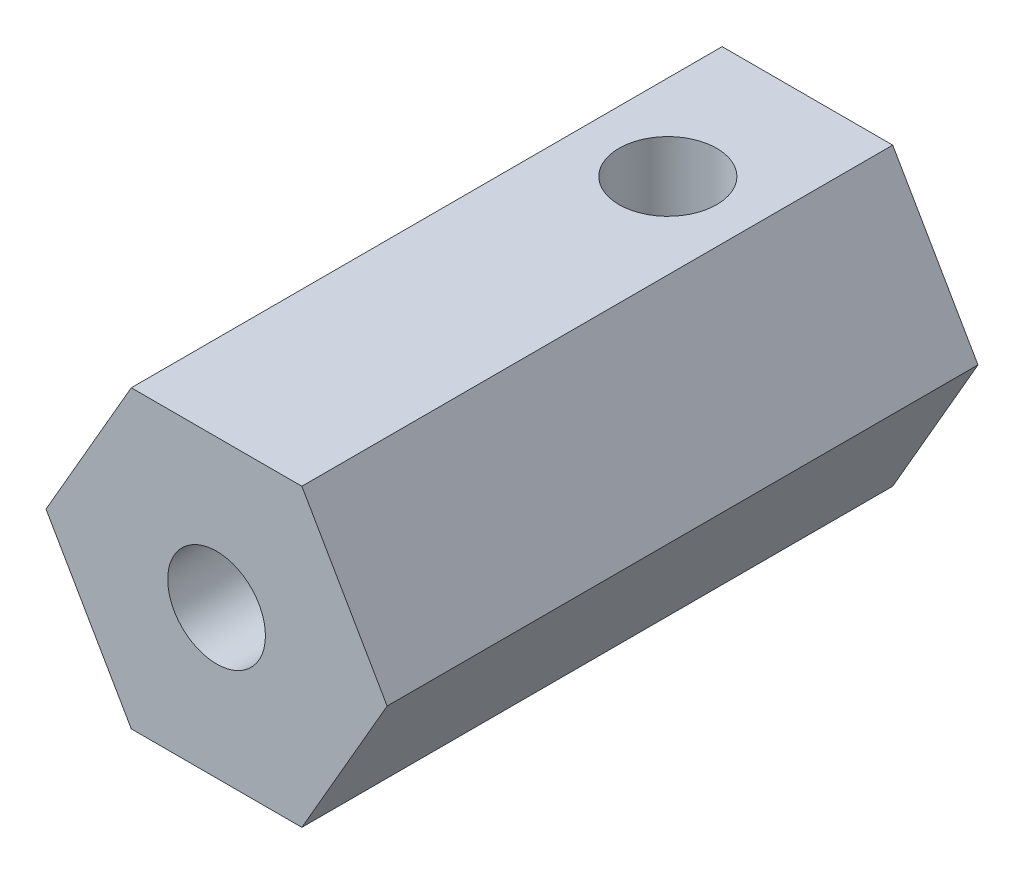
ISO-10303-21;
HEADER;
FILE_DESCRIPTION(('STEP AP214'),'2;1');
FILE_NAME('part.step','',(''),(''),'','','');
FILE_SCHEMA(('AUTOMOTIVE_DESIGN { 1 0 10303 214 1 1 1 1 }'));
ENDSEC;
DATA;
#1=APPLICATION_CONTEXT('core data for automotive mechanical design processes');
#2=APPLICATION_PROTOCOL_DEFINITION('international standard','automotive_design',2000,#1);
#3=PRODUCT_CONTEXT('',#1,'mechanical');
#4=PRODUCT('Part','Part','',(#3));
#5=PRODUCT_RELATED_PRODUCT_CATEGORY('part','',(#4));
#6=PRODUCT_DEFINITION_FORMATION('','',#4);
#7=PRODUCT_DEFINITION_CONTEXT('part definition',#1,'design');
#8=PRODUCT_DEFINITION('design','',#6,#7);
#9=PRODUCT_DEFINITION_SHAPE('','',#8);
#10=(LENGTH_UNIT() NAMED_UNIT(*) SI_UNIT(.MILLI.,.METRE.));
#11=(NAMED_UNIT(*) PLANE_ANGLE_UNIT() SI_UNIT($,.RADIAN.));
#12=(NAMED_UNIT(*) SI_UNIT($,.STERADIAN.) SOLID_ANGLE_UNIT());
#13=UNCERTAINTY_MEASURE_WITH_UNIT(LENGTH_MEASURE(1.E-05),#10,'distance_accuracy_value','');
#14=(GEOMETRIC_REPRESENTATION_CONTEXT(3) GLOBAL_UNCERTAINTY_ASSIGNED_CONTEXT((#13)) GLOBAL_UNIT_ASSIGNED_CONTEXT((#10,
#11,#12)) REPRESENTATION_CONTEXT('',''));
#15=CARTESIAN_POINT('',(0.,0.,0.));
#16=DIRECTION('',(0.,0.,1.));
#17=DIRECTION('',(1.,0.,0.));
#18=AXIS2_PLACEMENT_3D('',#15,#16,#17);
#19=CARTESIAN_POINT('',(3.66617420935418,-6.34999999999994,25.4));
#20=DIRECTION('',(-0.866025403784441,0.499999999999995,0.));
#21=DIRECTION('',(-0.499999999999995,-0.866025403784442,0.));
#22=AXIS2_PLACEMENT_3D('',#19,#20,#21);
#23=PLANE('',#22);
#24=DIRECTION('',(0.499999999999995,0.866025403784442,0.));
#25=VECTOR('',#24,1.);
#26=CARTESIAN_POINT('',(3.66617420935418,-6.34999999999994,0.));
#27=LINE('',#26,#25);
#28=CARTESIAN_POINT('',(3.66617420935418,-6.34999999999994,0.));
#29=VERTEX_POINT('',#28);
#30=CARTESIAN_POINT('',(7.33234841870822,0.,0.));
#31=VERTEX_POINT('',#30);
#32=EDGE_CURVE('E124',#29,#31,#27,.T.);
#33=ORIENTED_EDGE('',*,*,#32,.T.);
#34=DIRECTION('',(0.,0.,-1.));
#35=VECTOR('',#34,1.);
#36=CARTESIAN_POINT('',(7.33234841870822,0.,25.4));
#37=LINE('',#36,#35);
#38=CARTESIAN_POINT('',(7.33234841870822,0.,25.4));
#39=VERTEX_POINT('',#38);
#40=EDGE_CURVE('E11',#39,#31,#37,.T.);
#41=ORIENTED_EDGE('',*,*,#40,.F.);
#42=DIRECTION('',(0.499999999999995,0.866025403784442,0.));
#43=VECTOR('',#42,1.);
#44=CARTESIAN_POINT('',(3.66617420935418,-6.34999999999994,25.4));
#45=LINE('',#44,#43);
#46=CARTESIAN_POINT('',(3.66617420935418,-6.34999999999994,25.4));
#47=VERTEX_POINT('',#46);
#48=EDGE_CURVE('E135',#47,#39,#45,.T.);
#49=ORIENTED_EDGE('',*,*,#48,.F.);
#50=DIRECTION('',(0.,0.,-1.));
#51=VECTOR('',#50,1.);
#52=CARTESIAN_POINT('',(3.66617420935418,-6.34999999999994,25.4));
#53=LINE('',#52,#51);
#54=EDGE_CURVE('E120',#47,#29,#53,.T.);
#55=ORIENTED_EDGE('',*,*,#54,.T.);
#56=EDGE_LOOP('',(#33,#41,#49,#55));
#57=FACE_BOUND('',#56,.T.);
#58=ADVANCED_FACE('F40',(#57),#23,.F.);
#59=CARTESIAN_POINT('',(7.33234841870822,0.,25.4));
#60=DIRECTION('',(-0.866025403784438,-0.500000000000001,0.));
#61=DIRECTION('',(0.500000000000001,-0.866025403784438,0.));
#62=AXIS2_PLACEMENT_3D('',#59,#60,#61);
#63=PLANE('',#62);
#64=DIRECTION('',(-0.500000000000001,0.866025403784438,0.));
#65=VECTOR('',#64,1.);
#66=CARTESIAN_POINT('',(7.33234841870822,0.,0.));
#67=LINE('',#66,#65);
#68=CARTESIAN_POINT('',(3.66617420935409,6.34999999999998,0.));
#69=VERTEX_POINT('',#68);
#70=EDGE_CURVE('E127',#31,#69,#67,.T.);
#71=ORIENTED_EDGE('',*,*,#70,.T.);
#72=DIRECTION('',(0.,0.,-1.));
#73=VECTOR('',#72,1.);
#74=CARTESIAN_POINT('',(3.66617420935409,6.34999999999998,25.4));
#75=LINE('',#74,#73);
#76=CARTESIAN_POINT('',(3.66617420935409,6.34999999999998,25.4));
#77=VERTEX_POINT('',#76);
#78=EDGE_CURVE('E48',#77,#69,#75,.T.);
#79=ORIENTED_EDGE('',*,*,#78,.F.);
#80=DIRECTION('',(-0.500000000000001,0.866025403784438,0.));
#81=VECTOR('',#80,1.);
#82=CARTESIAN_POINT('',(7.33234841870822,0.,25.4));
#83=LINE('',#82,#81);
#84=EDGE_CURVE('E93',#39,#77,#83,.T.);
#85=ORIENTED_EDGE('',*,*,#84,.F.);
#86=ORIENTED_EDGE('',*,*,#40,.T.);
#87=EDGE_LOOP('',(#71,#79,#85,#86));
#88=FACE_BOUND('',#87,.T.);
#89=ADVANCED_FACE('F160',(#88),#63,.F.);
#90=CARTESIAN_POINT('',(3.66617420935409,6.34999999999998,25.4));
#91=DIRECTION('',(0.,-1.,0.));
#92=DIRECTION('',(1.,0.,0.));
#93=AXIS2_PLACEMENT_3D('',#90,#91,#92);
#94=PLANE('',#93);
#95=CARTESIAN_POINT('',(0.,6.34999999999997,6.00000000000001));
#96=DIRECTION('',(0.,1.,0.));
#97=DIRECTION('',(0.,0.,1.));
#98=AXIS2_PLACEMENT_3D('',#95,#96,#97);
#99=CIRCLE('',#98,2.09999999999999);
#100=CARTESIAN_POINT('',(0.,6.34999999999997,8.09999999999999));
#101=VERTEX_POINT('',#100);
#102=EDGE_CURVE('E293',#101,#101,#99,.T.);
#103=ORIENTED_EDGE('',*,*,#102,.F.);
#104=EDGE_LOOP('',(#103));
#105=FACE_BOUND('',#104,.T.);
#106=DIRECTION('',(-1.,0.,0.));
#107=VECTOR('',#106,1.);
#108=CARTESIAN_POINT('',(3.66617420935409,6.34999999999998,0.));
#109=LINE('',#108,#107);
#110=CARTESIAN_POINT('',(-3.66617420935414,6.34999999999995,0.));
#111=VERTEX_POINT('',#110);
#112=EDGE_CURVE('E130',#69,#111,#109,.T.);
#113=ORIENTED_EDGE('',*,*,#112,.T.);
#114=DIRECTION('',(0.,0.,-1.));
#115=VECTOR('',#114,1.);
#116=CARTESIAN_POINT('',(-3.66617420935414,6.34999999999995,25.4));
#117=LINE('',#116,#115);
#118=CARTESIAN_POINT('',(-3.66617420935414,6.34999999999995,25.4));
#119=VERTEX_POINT('',#118);
#120=EDGE_CURVE('E115',#119,#111,#117,.T.);
#121=ORIENTED_EDGE('',*,*,#120,.F.);
#122=DIRECTION('',(-1.,0.,0.));
#123=VECTOR('',#122,1.);
#124=CARTESIAN_POINT('',(3.66617420935409,6.34999999999998,25.4));
#125=LINE('',#124,#123);
#126=EDGE_CURVE('E106',#77,#119,#125,.T.);
#127=ORIENTED_EDGE('',*,*,#126,.F.);
#128=ORIENTED_EDGE('',*,*,#78,.T.);
#129=EDGE_LOOP('',(#113,#121,#127,#128));
#130=FACE_BOUND('',#129,.T.);
#131=ADVANCED_FACE('F141',(#105,#130),#94,.F.);
#132=CARTESIAN_POINT('',(-3.66617420935414,6.34999999999995,25.4));
#133=DIRECTION('',(0.866025403784441,-0.499999999999995,0.));
#134=DIRECTION('',(0.499999999999995,0.866025403784442,0.));
#135=AXIS2_PLACEMENT_3D('',#132,#133,#134);
#136=PLANE('',#135);
#137=DIRECTION('',(-0.499999999999995,-0.866025403784441,0.));
#138=VECTOR('',#137,1.);
#139=CARTESIAN_POINT('',(-3.66617420935414,6.34999999999995,0.));
#140=LINE('',#139,#138);
#141=CARTESIAN_POINT('',(-7.33234841870822,0.,0.));
#142=VERTEX_POINT('',#141);
#143=EDGE_CURVE('E114',#111,#142,#140,.T.);
#144=ORIENTED_EDGE('',*,*,#143,.T.);
#145=DIRECTION('',(0.,0.,-1.));
#146=VECTOR('',#145,1.);
#147=CARTESIAN_POINT('',(-7.33234841870822,0.,25.4));
#148=LINE('',#147,#146);
#149=CARTESIAN_POINT('',(-7.33234841870822,0.,25.4));
#150=VERTEX_POINT('',#149);
#151=EDGE_CURVE('E111',#150,#142,#148,.T.);
#152=ORIENTED_EDGE('',*,*,#151,.F.);
#153=DIRECTION('',(-0.499999999999995,-0.866025403784441,0.));
#154=VECTOR('',#153,1.);
#155=CARTESIAN_POINT('',(-3.66617420935414,6.34999999999995,25.4));
#156=LINE('',#155,#154);
#157=EDGE_CURVE('E100',#119,#150,#156,.T.);
#158=ORIENTED_EDGE('',*,*,#157,.F.);
#159=ORIENTED_EDGE('',*,*,#120,.T.);
#160=EDGE_LOOP('',(#144,#152,#158,#159));
#161=FACE_BOUND('',#160,.T.);
#162=ADVANCED_FACE('F112',(#161),#136,.F.);
#163=CARTESIAN_POINT('',(-7.33234841870822,0.,25.4));
#164=DIRECTION('',(0.866025403784435,0.500000000000007,0.));
#165=DIRECTION('',(-0.500000000000007,0.866025403784435,0.));
#166=AXIS2_PLACEMENT_3D('',#163,#164,#165);
#167=PLANE('',#166);
#168=DIRECTION('',(0.500000000000007,-0.866025403784434,0.));
#169=VECTOR('',#168,1.);
#170=CARTESIAN_POINT('',(-7.33234841870822,0.,0.));
#171=LINE('',#170,#169);
#172=CARTESIAN_POINT('',(-3.66617420935405,-6.35000000000001,0.));
#173=VERTEX_POINT('',#172);
#174=EDGE_CURVE('E79',#142,#173,#171,.T.);
#175=ORIENTED_EDGE('',*,*,#174,.T.);
#176=DIRECTION('',(0.,0.,-1.));
#177=VECTOR('',#176,1.);
#178=CARTESIAN_POINT('',(-3.66617420935405,-6.35000000000001,25.4));
#179=LINE('',#178,#177);
#180=CARTESIAN_POINT('',(-3.66617420935405,-6.35000000000001,25.4));
#181=VERTEX_POINT('',#180);
#182=EDGE_CURVE('E116',#181,#173,#179,.T.);
#183=ORIENTED_EDGE('',*,*,#182,.F.);
#184=DIRECTION('',(0.500000000000007,-0.866025403784434,0.));
#185=VECTOR('',#184,1.);
#186=CARTESIAN_POINT('',(-7.33234841870822,0.,25.4));
#187=LINE('',#186,#185);
#188=EDGE_CURVE('E104',#150,#181,#187,.T.);
#189=ORIENTED_EDGE('',*,*,#188,.F.);
#190=ORIENTED_EDGE('',*,*,#151,.T.);
#191=EDGE_LOOP('',(#175,#183,#189,#190));
#192=FACE_BOUND('',#191,.T.);
#193=ADVANCED_FACE('F118',(#192),#167,.F.);
#194=CARTESIAN_POINT('',(-3.66617420935405,-6.35000000000001,25.4));
#195=DIRECTION('',(0.,1.,0.));
#196=DIRECTION('',(-1.,0.,0.));
#197=AXIS2_PLACEMENT_3D('',#194,#195,#196);
#198=PLANE('',#197);
#199=DIRECTION('',(1.,0.,0.));
#200=VECTOR('',#199,1.);
#201=CARTESIAN_POINT('',(-3.66617420935405,-6.35000000000001,0.));
#202=LINE('',#201,#200);
#203=EDGE_CURVE('E85',#173,#29,#202,.T.);
#204=ORIENTED_EDGE('',*,*,#203,.T.);
#205=ORIENTED_EDGE('',*,*,#54,.F.);
#206=DIRECTION('',(1.,0.,0.));
#207=VECTOR('',#206,1.);
#208=CARTESIAN_POINT('',(-3.66617420935405,-6.35000000000001,25.4));
#209=LINE('',#208,#207);
#210=EDGE_CURVE('E56',#181,#47,#209,.T.);
#211=ORIENTED_EDGE('',*,*,#210,.F.);
#212=ORIENTED_EDGE('',*,*,#182,.T.);
#213=EDGE_LOOP('',(#204,#205,#211,#212));
#214=FACE_BOUND('',#213,.T.);
#215=ADVANCED_FACE('F148',(#214),#198,.F.);
#216=CARTESIAN_POINT('',(0.,0.,25.4));
#217=DIRECTION('',(0.,0.,1.));
#218=DIRECTION('',(1.,0.,0.));
#219=AXIS2_PLACEMENT_3D('',#216,#217,#218);
#220=PLANE('',#219);
#221=CARTESIAN_POINT('',(0.,0.,25.4));
#222=DIRECTION('',(0.,0.,1.));
#223=DIRECTION('',(1.,0.,0.));
#224=AXIS2_PLACEMENT_3D('',#221,#222,#223);
#225=CIRCLE('',#224,2.09999999999999);
#226=CARTESIAN_POINT('',(2.09999999999999,0.,25.4));
#227=VERTEX_POINT('',#226);
#228=EDGE_CURVE('E292',#227,#227,#225,.T.);
#229=ORIENTED_EDGE('',*,*,#228,.F.);
#230=EDGE_LOOP('',(#229));
#231=FACE_BOUND('',#230,.T.);
#232=ORIENTED_EDGE('',*,*,#48,.T.);
#233=ORIENTED_EDGE('',*,*,#84,.T.);
#234=ORIENTED_EDGE('',*,*,#126,.T.);
#235=ORIENTED_EDGE('',*,*,#157,.T.);
#236=ORIENTED_EDGE('',*,*,#188,.T.);
#237=ORIENTED_EDGE('',*,*,#210,.T.);
#238=EDGE_LOOP('',(#232,#233,#234,#235,#236,#237));
#239=FACE_BOUND('',#238,.T.);
#240=ADVANCED_FACE('F102',(#231,#239),#220,.T.);
#241=CARTESIAN_POINT('',(0.,0.,0.));
#242=DIRECTION('',(0.,0.,1.));
#243=DIRECTION('',(1.,0.,0.));
#244=AXIS2_PLACEMENT_3D('',#241,#242,#243);
#245=PLANE('',#244);
#246=CARTESIAN_POINT('',(0.,0.,0.));
#247=DIRECTION('',(0.,0.,-1.));
#248=DIRECTION('',(-1.,0.,0.));
#249=AXIS2_PLACEMENT_3D('',#246,#247,#248);
#250=CIRCLE('',#249,3.);
#251=CARTESIAN_POINT('',(-3.,0.,0.));
#252=VERTEX_POINT('',#251);
#253=EDGE_CURVE('E299',#252,#252,#250,.T.);
#254=ORIENTED_EDGE('',*,*,#253,.F.);
#255=EDGE_LOOP('',(#254));
#256=FACE_BOUND('',#255,.T.);
#257=ORIENTED_EDGE('',*,*,#32,.F.);
#258=ORIENTED_EDGE('',*,*,#203,.F.);
#259=ORIENTED_EDGE('',*,*,#174,.F.);
#260=ORIENTED_EDGE('',*,*,#143,.F.);
#261=ORIENTED_EDGE('',*,*,#112,.F.);
#262=ORIENTED_EDGE('',*,*,#70,.F.);
#263=EDGE_LOOP('',(#257,#258,#259,#260,#261,#262));
#264=FACE_BOUND('',#263,.T.);
#265=ADVANCED_FACE('F144',(#256,#264),#245,.F.);
#266=CARTESIAN_POINT('',(0.,0.,12.7));
#267=DIRECTION('',(0.,0.,-1.));
#268=DIRECTION('',(-1.,0.,0.));
#269=AXIS2_PLACEMENT_3D('',#266,#267,#268);
#270=CYLINDRICAL_SURFACE('',#269,3.);
#271=CARTESIAN_POINT('',(0.,3.,8.1));
#272=CARTESIAN_POINT('',(0.104432736756778,3.0000050152222,8.10000541798649));
#273=CARTESIAN_POINT('',(0.20883759159973,2.99450336810008,8.09216940555202));
#274=CARTESIAN_POINT('',(0.41428056238167,2.97305256113938,8.06135003798907));
#275=CARTESIAN_POINT('',(0.515317672512081,2.95710030899515,8.03836219946412));
#276=CARTESIAN_POINT('',(0.71073725107288,2.91629644184759,7.9787000885394));
#277=CARTESIAN_POINT('',(0.805149331516088,2.89148790754811,7.94209203485838));
#278=CARTESIAN_POINT('',(0.986035093833938,2.83491221453118,7.85681022210094));
#279=CARTESIAN_POINT('',(1.07250761472735,2.80314404041606,7.80813470226852));
#280=CARTESIAN_POINT('',(1.24369872556274,2.73176784302595,7.6954726536355));
#281=CARTESIAN_POINT('',(1.32758783389914,2.69171520261513,7.6305135255467));
#282=CARTESIAN_POINT('',(1.484036583453,2.60873460721869,7.48954547723325));
#283=CARTESIAN_POINT('',(1.55657892522037,2.56580240167057,7.41352001929936));
#284=CARTESIAN_POINT('',(1.7013771272155,2.47264077401941,7.23715351950136));
#285=CARTESIAN_POINT('',(1.77133397258451,2.42245737067268,7.13488804387979));
#286=CARTESIAN_POINT('',(1.89310898809432,2.32852755957092,6.91739311408122));
#287=CARTESIAN_POINT('',(1.94495749509098,2.2847704578293,6.80218577360837));
#288=CARTESIAN_POINT('',(2.01498307834336,2.22290646234522,6.5979808095873));
#289=CARTESIAN_POINT('',(2.03861798562966,2.20105556558986,6.51200295515287));
#290=CARTESIAN_POINT('',(2.07488644354206,2.16690520157562,6.33598373142374));
#291=CARTESIAN_POINT('',(2.08754153098924,2.15458704109171,6.24595068311794));
#292=CARTESIAN_POINT('',(2.10103535329795,2.14143714863609,6.06360356522246));
#293=CARTESIAN_POINT('',(2.10180632983027,2.1406712836483,5.97127941961925));
#294=CARTESIAN_POINT('',(2.09128754594084,2.15094423222529,5.78796393071831));
#295=CARTESIAN_POINT('',(2.07998949040315,2.16199116479988,5.6969735477222));
#296=CARTESIAN_POINT('',(2.04730470274488,2.1929425532739,5.52490325834344));
#297=CARTESIAN_POINT('',(2.02663325264529,2.21221410063627,5.44356565364422));
#298=CARTESIAN_POINT('',(1.97646505622518,2.25714870959386,5.28552760553106));
#299=CARTESIAN_POINT('',(1.94696123452481,2.28281689259262,5.20883093928731));
#300=CARTESIAN_POINT('',(1.862173728944,2.3530221517865,5.02132179239673));
#301=CARTESIAN_POINT('',(1.80151440663775,2.40034945009227,4.91397258196229));
#302=CARTESIAN_POINT('',(1.663304154319,2.4981230105921,4.71220508801157));
#303=CARTESIAN_POINT('',(1.58571887211059,2.54857546413484,4.61781374741702));
#304=CARTESIAN_POINT('',(1.41369005703778,2.64791832012554,4.44219511412161));
#305=CARTESIAN_POINT('',(1.31905685997906,2.69678298262459,4.36113787921883));
#306=CARTESIAN_POINT('',(1.11475642581072,2.7874264490965,4.21591702499149));
#307=CARTESIAN_POINT('',(1.00512108490414,2.82921987658115,4.15171838588851));
#308=CARTESIAN_POINT('',(0.798620087620465,2.89329979147812,4.05521975131373));
#309=CARTESIAN_POINT('',(0.7042879426896,2.91785610625561,4.01900559135393));
#310=CARTESIAN_POINT('',(0.509635091176931,2.95806006950583,3.96024934118802));
#311=CARTESIAN_POINT('',(0.409318514781678,2.9737137853305,3.93769793877257));
#312=CARTESIAN_POINT('',(0.204960949383361,2.99475845287274,3.90746621974828));
#313=CARTESIAN_POINT('',(0.100906572203611,3.00010776282411,3.89984624130456));
#314=CARTESIAN_POINT('',(-0.10716928666574,2.99988896874348,3.90015842789449));
#315=CARTESIAN_POINT('',(-0.211190769629207,2.99432135797153,3.90808989026621));
#316=CARTESIAN_POINT('',(-0.40912721463153,2.97352984947781,3.93796630288099));
#317=CARTESIAN_POINT('',(-0.503258725094151,2.95895980106732,3.95896299979098));
#318=CARTESIAN_POINT('',(-0.686325704469224,2.92193204355335,4.01302398040054));
#319=CARTESIAN_POINT('',(-0.775260200537521,2.89947286314204,4.04609051514655));
#320=CARTESIAN_POINT('',(-0.952402800092489,2.84641444263186,4.12569510865439));
#321=CARTESIAN_POINT('',(-1.0401151428465,2.81535201209803,4.17302023319139));
#322=CARTESIAN_POINT('',(-1.20663723181805,2.74810948094338,4.27844432471833));
#323=CARTESIAN_POINT('',(-1.28544133212272,2.71192616713073,4.33655006337472));
#324=CARTESIAN_POINT('',(-1.44614034529395,2.63023261499557,4.47303625048108));
#325=CARTESIAN_POINT('',(-1.5262606719918,2.58418535620985,4.5531845840817));
#326=CARTESIAN_POINT('',(-1.67267885687487,2.49191411975568,4.72527432506064));
#327=CARTESIAN_POINT('',(-1.73896576204691,2.44569003134223,4.81722498494576));
#328=CARTESIAN_POINT('',(-1.85100448863883,2.36182108699418,5.00281351812979));
#329=CARTESIAN_POINT('',(-1.89811453336918,2.32377854491526,5.09544754087814));
#330=CARTESIAN_POINT('',(-1.97877743631115,2.25549089653318,5.28909313744803));
#331=CARTESIAN_POINT('',(-2.01235678465502,2.22523059676437,5.39008787067438));
#332=CARTESIAN_POINT('',(-2.05889586072261,2.18214360188213,5.5777407426536));
#333=CARTESIAN_POINT('',(-2.0746526367435,2.16702854170015,5.66316614836002));
#334=CARTESIAN_POINT('',(-2.09543298645792,2.14694710291476,5.8364480506445));
#335=CARTESIAN_POINT('',(-2.1004704716513,2.14196757078445,5.92430124616595));
#336=CARTESIAN_POINT('',(-2.09945931747968,2.14295830541304,6.0999841188625));
#337=CARTESIAN_POINT('',(-2.09339735736258,2.14894172912499,6.18781364109259));
#338=CARTESIAN_POINT('',(-2.07061236640783,2.17089889092004,6.36084206702707));
#339=CARTESIAN_POINT('',(-2.05387376647253,2.186887217902,6.44603693823845));
#340=CARTESIAN_POINT('',(-2.00457714334536,2.23227997508798,6.63542766170549));
#341=CARTESIAN_POINT('',(-1.96888571886365,2.26419866451956,6.73819102109654));
#342=CARTESIAN_POINT('',(-1.88351751108905,2.33569147819062,6.93482705600995));
#343=CARTESIAN_POINT('',(-1.83381899355397,2.37527746937741,7.02868560936396));
#344=CARTESIAN_POINT('',(-1.72043576919967,2.45869356297524,7.20900940146585));
#345=CARTESIAN_POINT('',(-1.65644646476246,2.50260222727325,7.2952456390636));
#346=CARTESIAN_POINT('',(-1.51601227466491,2.59008915874815,7.4571179903739));
#347=CARTESIAN_POINT('',(-1.43956326934759,2.63366731164085,7.53275058267448));
#348=CARTESIAN_POINT('',(-1.25960522816592,2.72494957392672,7.68514953658433));
#349=CARTESIAN_POINT('',(-1.15370530854201,2.77193854555148,7.75956628928994));
#350=CARTESIAN_POINT('',(-0.926928125504238,2.8557576658829,7.88885318579408));
#351=CARTESIAN_POINT('',(-0.806068565323955,2.89259965904062,7.94374614150247));
#352=CARTESIAN_POINT('',(-0.571963359516899,2.94704141024225,8.02380138722456));
#353=CARTESIAN_POINT('',(-0.460312434733227,2.96670352657162,8.0521962326055));
#354=CARTESIAN_POINT('',(-0.232425474354114,2.99317183514558,8.09028059918451));
#355=CARTESIAN_POINT('',(-0.116195478888468,2.99999441989014,8.09999397176063));
#356=CARTESIAN_POINT('',(0.,3.,8.1));
#357=B_SPLINE_CURVE_WITH_KNOTS('',3,(#271,#272,#273,#274,#275,#276,#277,#278,#279,#280,#281,
#282,#283,#284,#285,#286,#287,#288,#289,#290,#291,#292,#293,#294,#295,#296,#297,#298,#299,#300,
#301,#302,#303,#304,#305,#306,#307,#308,#309,#310,#311,#312,#313,#314,#315,#316,#317,#318,#319,
#320,#321,#322,#323,#324,#325,#326,#327,#328,#329,#330,#331,#332,#333,#334,#335,#336,#337,#338,
#339,#340,#341,#342,#343,#344,#345,#346,#347,#348,#349,#350,#351,#352,#353,#354,#355,#356),
.UNSPECIFIED.,.T.,.F.,(4,2,2,2,2,2,2,2,2,2,2,2,2,2,2,2,2,2,2,2,2,2,2,2,2,2,2,2,2,2,2,2,2,2,2,2,
2,2,2,2,2,2,4),(0.,0.312830135122893,0.625752877667147,0.937173721634588,1.24864003158137,
1.58761600143561,1.9271038448808,2.32636156297915,2.7249471604614,2.99932727060843,
3.27316796187222,3.54856940669049,3.82416025838319,4.08155699633904,4.33916048231395,
4.73329686394153,5.12824073543258,5.52788543515456,5.92669327959754,6.23735439961542,
6.54780354152542,6.85950464801142,7.17119167120738,7.46253895064098,7.75394059465181,
8.06594141203253,8.37813887522279,8.74370645851921,9.10956240149164,9.44040109328499,
9.77058889128977,10.033982344698,10.2970337569708,10.560401071483,10.8241533193739,
11.1624263203296,11.5012271232577,11.8480878151309,12.1950634260413,12.6058514218173,
13.0161578573947,13.3646687512902,13.7127343913393),.UNSPECIFIED.);
#358=CARTESIAN_POINT('',(0.,3.,8.1));
#359=VERTEX_POINT('',#358);
#360=EDGE_CURVE('E285',#359,#359,#357,.T.);
#361=ORIENTED_EDGE('',*,*,#360,.T.);
#362=EDGE_LOOP('',(#361));
#363=FACE_BOUND('',#362,.T.);
#364=CARTESIAN_POINT('',(0.,0.,12.7));
#365=DIRECTION('',(0.,0.,-1.));
#366=DIRECTION('',(-1.,0.,0.));
#367=AXIS2_PLACEMENT_3D('',#364,#365,#366);
#368=CIRCLE('',#367,3.);
#369=CARTESIAN_POINT('',(-3.,0.,12.7));
#370=VERTEX_POINT('',#369);
#371=EDGE_CURVE('E128',#370,#370,#368,.T.);
#372=ORIENTED_EDGE('',*,*,#371,.F.);
#373=EDGE_LOOP('',(#372));
#374=FACE_BOUND('',#373,.T.);
#375=ORIENTED_EDGE('',*,*,#253,.T.);
#376=EDGE_LOOP('',(#375));
#377=FACE_BOUND('',#376,.T.);
#378=ADVANCED_FACE('F198',(#363,#374,#377),#270,.F.);
#379=CARTESIAN_POINT('',(0.,0.,12.7));
#380=DIRECTION('',(0.,0.,-1.));
#381=DIRECTION('',(-1.,0.,0.));
#382=AXIS2_PLACEMENT_3D('',#379,#380,#381);
#383=PLANE('',#382);
#384=CARTESIAN_POINT('',(0.,0.,12.7));
#385=DIRECTION('',(0.,0.,-1.));
#386=DIRECTION('',(-1.,0.,0.));
#387=AXIS2_PLACEMENT_3D('',#384,#385,#386);
#388=CIRCLE('',#387,2.09999999999999);
#389=CARTESIAN_POINT('',(-2.09999999999999,0.,12.7));
#390=VERTEX_POINT('',#389);
#391=EDGE_CURVE('E296',#390,#390,#388,.T.);
#392=ORIENTED_EDGE('',*,*,#391,.F.);
#393=EDGE_LOOP('',(#392));
#394=FACE_BOUND('',#393,.T.);
#395=ORIENTED_EDGE('',*,*,#371,.T.);
#396=EDGE_LOOP('',(#395));
#397=FACE_BOUND('',#396,.T.);
#398=ADVANCED_FACE('F207',(#394,#397),#383,.T.);
#399=CARTESIAN_POINT('',(0.,0.,25.4));
#400=DIRECTION('',(0.,0.,1.));
#401=DIRECTION('',(1.,0.,0.));
#402=AXIS2_PLACEMENT_3D('',#399,#400,#401);
#403=CYLINDRICAL_SURFACE('',#402,2.09999999999999);
#404=ORIENTED_EDGE('',*,*,#228,.T.);
#405=EDGE_LOOP('',(#404));
#406=FACE_BOUND('',#405,.T.);
#407=ORIENTED_EDGE('',*,*,#391,.T.);
#408=EDGE_LOOP('',(#407));
#409=FACE_BOUND('',#408,.T.);
#410=ADVANCED_FACE('F217',(#406,#409),#403,.F.);
#411=CARTESIAN_POINT('',(0.,6.34999999999997,6.00000000000001));
#412=DIRECTION('',(0.,1.,0.));
#413=DIRECTION('',(0.,0.,1.));
#414=AXIS2_PLACEMENT_3D('',#411,#412,#413);
#415=CYLINDRICAL_SURFACE('',#414,2.09999999999999);
#416=ORIENTED_EDGE('',*,*,#360,.F.);
#417=EDGE_LOOP('',(#416));
#418=FACE_BOUND('',#417,.T.);
#419=ORIENTED_EDGE('',*,*,#102,.T.);
#420=EDGE_LOOP('',(#419));
#421=FACE_BOUND('',#420,.T.);
#422=ADVANCED_FACE('F227',(#418,#421),#415,.F.);
#423=CLOSED_SHELL('',(#58,#89,#131,#162,#193,#215,#240,#265,#378,#398,#410,#422));
#424=MANIFOLD_SOLID_BREP('B2',#423);
#425=ADVANCED_BREP_SHAPE_REPRESENTATION('',(#18,#424),#14);
#426=SHAPE_DEFINITION_REPRESENTATION(#9,#425);
ENDSEC;
END-ISO-10303-21;
